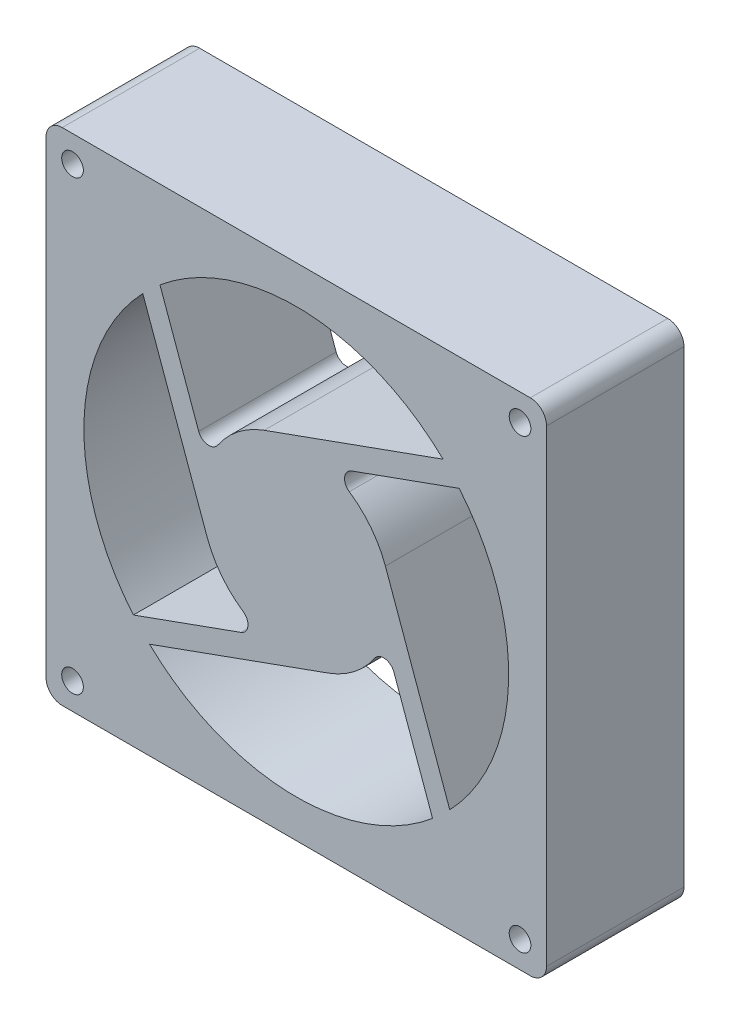
ISO-10303-21;
HEADER;
FILE_DESCRIPTION(('STEP AP214'),'2;1');
FILE_NAME('part.step','',(''),(''),'','','');
FILE_SCHEMA(('AUTOMOTIVE_DESIGN { 1 0 10303 214 1 1 1 1 }'));
ENDSEC;
DATA;
#1=APPLICATION_CONTEXT('core data for automotive mechanical design processes');
#2=APPLICATION_PROTOCOL_DEFINITION('international standard','automotive_design',2000,#1);
#3=PRODUCT_CONTEXT('',#1,'mechanical');
#4=PRODUCT('Part','Part','',(#3));
#5=PRODUCT_RELATED_PRODUCT_CATEGORY('part','',(#4));
#6=PRODUCT_DEFINITION_FORMATION('','',#4);
#7=PRODUCT_DEFINITION_CONTEXT('part definition',#1,'design');
#8=PRODUCT_DEFINITION('design','',#6,#7);
#9=PRODUCT_DEFINITION_SHAPE('','',#8);
#10=(LENGTH_UNIT() NAMED_UNIT(*) SI_UNIT(.MILLI.,.METRE.));
#11=(NAMED_UNIT(*) PLANE_ANGLE_UNIT() SI_UNIT($,.RADIAN.));
#12=(NAMED_UNIT(*) SI_UNIT($,.STERADIAN.) SOLID_ANGLE_UNIT());
#13=UNCERTAINTY_MEASURE_WITH_UNIT(LENGTH_MEASURE(1.E-05),#10,'distance_accuracy_value','');
#14=(GEOMETRIC_REPRESENTATION_CONTEXT(3) GLOBAL_UNCERTAINTY_ASSIGNED_CONTEXT((#13)) GLOBAL_UNIT_ASSIGNED_CONTEXT((#10,
#11,#12)) REPRESENTATION_CONTEXT('',''));
#15=CARTESIAN_POINT('',(0.,0.,0.));
#16=DIRECTION('',(0.,0.,1.));
#17=DIRECTION('',(1.,0.,0.));
#18=AXIS2_PLACEMENT_3D('',#15,#16,#17);
#19=CARTESIAN_POINT('',(0.,0.,25.4));
#20=DIRECTION('',(0.,0.,1.));
#21=DIRECTION('',(1.,0.,0.));
#22=AXIS2_PLACEMENT_3D('',#19,#20,#21);
#23=PLANE('',#22);
#24=CARTESIAN_POINT('',(41.35,-41.35,25.4));
#25=DIRECTION('',(0.,0.,1.));
#26=DIRECTION('',(1.,0.,0.));
#27=AXIS2_PLACEMENT_3D('',#24,#25,#26);
#28=CIRCLE('',#27,2.);
#29=CARTESIAN_POINT('',(43.35,-41.35,25.4));
#30=VERTEX_POINT('',#29);
#31=EDGE_CURVE('E457',#30,#30,#28,.T.);
#32=ORIENTED_EDGE('',*,*,#31,.F.);
#33=EDGE_LOOP('',(#32));
#34=FACE_BOUND('',#33,.T.);
#35=CARTESIAN_POINT('',(-41.35,41.35,25.4));
#36=DIRECTION('',(0.,0.,1.));
#37=DIRECTION('',(1.,0.,0.));
#38=AXIS2_PLACEMENT_3D('',#35,#36,#37);
#39=CIRCLE('',#38,2.);
#40=CARTESIAN_POINT('',(-39.35,41.35,25.4));
#41=VERTEX_POINT('',#40);
#42=EDGE_CURVE('E473',#41,#41,#39,.T.);
#43=ORIENTED_EDGE('',*,*,#42,.F.);
#44=EDGE_LOOP('',(#43));
#45=FACE_BOUND('',#44,.T.);
#46=DIRECTION('',(0.,-1.,0.));
#47=VECTOR('',#46,1.);
#48=CARTESIAN_POINT('',(-46.25,46.25,25.4));
#49=LINE('',#48,#47);
#50=CARTESIAN_POINT('',(-46.25,43.25,25.4));
#51=VERTEX_POINT('',#50);
#52=CARTESIAN_POINT('',(-46.25,-43.25,25.4));
#53=VERTEX_POINT('',#52);
#54=EDGE_CURVE('E481',#51,#53,#49,.T.);
#55=ORIENTED_EDGE('',*,*,#54,.T.);
#56=CARTESIAN_POINT('',(-43.25,-43.25,25.4));
#57=DIRECTION('',(0.,0.,1.));
#58=DIRECTION('',(1.,0.,0.));
#59=AXIS2_PLACEMENT_3D('',#56,#57,#58);
#60=CIRCLE('',#59,3.);
#61=CARTESIAN_POINT('',(-43.25,-46.25,25.4));
#62=VERTEX_POINT('',#61);
#63=EDGE_CURVE('E543',#53,#62,#60,.T.);
#64=ORIENTED_EDGE('',*,*,#63,.T.);
#65=DIRECTION('',(1.,0.,0.));
#66=VECTOR('',#65,1.);
#67=CARTESIAN_POINT('',(-46.25,-46.25,25.4));
#68=LINE('',#67,#66);
#69=CARTESIAN_POINT('',(43.25,-46.25,25.4));
#70=VERTEX_POINT('',#69);
#71=EDGE_CURVE('E485',#62,#70,#68,.T.);
#72=ORIENTED_EDGE('',*,*,#71,.T.);
#73=CARTESIAN_POINT('',(43.25,-43.25,25.4));
#74=DIRECTION('',(0.,0.,1.));
#75=DIRECTION('',(1.,0.,0.));
#76=AXIS2_PLACEMENT_3D('',#73,#74,#75);
#77=CIRCLE('',#76,3.);
#78=CARTESIAN_POINT('',(46.25,-43.25,25.4));
#79=VERTEX_POINT('',#78);
#80=EDGE_CURVE('E540',#70,#79,#77,.T.);
#81=ORIENTED_EDGE('',*,*,#80,.T.);
#82=DIRECTION('',(0.,1.,0.));
#83=VECTOR('',#82,1.);
#84=CARTESIAN_POINT('',(46.25,46.25,25.4));
#85=LINE('',#84,#83);
#86=CARTESIAN_POINT('',(46.25,43.25,25.4));
#87=VERTEX_POINT('',#86);
#88=EDGE_CURVE('E490',#79,#87,#85,.T.);
#89=ORIENTED_EDGE('',*,*,#88,.T.);
#90=CARTESIAN_POINT('',(43.25,43.25,25.4));
#91=DIRECTION('',(0.,0.,1.));
#92=DIRECTION('',(1.,0.,0.));
#93=AXIS2_PLACEMENT_3D('',#90,#91,#92);
#94=CIRCLE('',#93,3.);
#95=CARTESIAN_POINT('',(43.25,46.25,25.4));
#96=VERTEX_POINT('',#95);
#97=EDGE_CURVE('E60',#87,#96,#94,.T.);
#98=ORIENTED_EDGE('',*,*,#97,.T.);
#99=DIRECTION('',(-1.,0.,0.));
#100=VECTOR('',#99,1.);
#101=CARTESIAN_POINT('',(-46.25,46.25,25.4));
#102=LINE('',#101,#100);
#103=CARTESIAN_POINT('',(-43.25,46.25,25.4));
#104=VERTEX_POINT('',#103);
#105=EDGE_CURVE('E493',#96,#104,#102,.T.);
#106=ORIENTED_EDGE('',*,*,#105,.T.);
#107=CARTESIAN_POINT('',(-43.25,43.25,25.4));
#108=DIRECTION('',(0.,0.,1.));
#109=DIRECTION('',(1.,0.,0.));
#110=AXIS2_PLACEMENT_3D('',#107,#108,#109);
#111=CIRCLE('',#110,3.);
#112=EDGE_CURVE('E537',#104,#51,#111,.T.);
#113=ORIENTED_EDGE('',*,*,#112,.T.);
#114=EDGE_LOOP('',(#55,#64,#72,#81,#89,#98,#106,#113));
#115=FACE_BOUND('',#114,.T.);
#116=CARTESIAN_POINT('',(-41.35,-41.35,25.4));
#117=DIRECTION('',(0.,0.,1.));
#118=DIRECTION('',(1.,0.,0.));
#119=AXIS2_PLACEMENT_3D('',#116,#117,#118);
#120=CIRCLE('',#119,2.);
#121=CARTESIAN_POINT('',(-39.35,-41.35,25.4));
#122=VERTEX_POINT('',#121);
#123=EDGE_CURVE('E465',#122,#122,#120,.T.);
#124=ORIENTED_EDGE('',*,*,#123,.F.);
#125=EDGE_LOOP('',(#124));
#126=FACE_BOUND('',#125,.T.);
#127=CARTESIAN_POINT('',(41.35,41.35,25.4));
#128=DIRECTION('',(0.,0.,1.));
#129=DIRECTION('',(1.,0.,0.));
#130=AXIS2_PLACEMENT_3D('',#127,#128,#129);
#131=CIRCLE('',#130,2.);
#132=CARTESIAN_POINT('',(43.35,41.35,25.4));
#133=VERTEX_POINT('',#132);
#134=EDGE_CURVE('E449',#133,#133,#131,.T.);
#135=ORIENTED_EDGE('',*,*,#134,.F.);
#136=EDGE_LOOP('',(#135));
#137=FACE_BOUND('',#136,.T.);
#138=DIRECTION('',(0.338728050885562,-0.940884322083894,0.));
#139=VECTOR('',#138,1.);
#140=CARTESIAN_POINT('',(16.4654756364681,5.92774089049734,25.4));
#141=LINE('',#140,#139);
#142=CARTESIAN_POINT('',(16.4654756364681,5.92774089049734,25.4));
#143=VERTEX_POINT('',#142);
#144=CARTESIAN_POINT('',(28.3659350270967,-27.128144611059,25.4));
#145=VERTEX_POINT('',#144);
#146=EDGE_CURVE('E399',#143,#145,#141,.T.);
#147=ORIENTED_EDGE('',*,*,#146,.F.);
#148=CARTESIAN_POINT('',(0.,0.,25.4));
#149=DIRECTION('',(0.,0.,-1.));
#150=DIRECTION('',(-1.,0.,0.));
#151=AXIS2_PLACEMENT_3D('',#148,#149,#150);
#152=CIRCLE('',#151,17.5);
#153=CARTESIAN_POINT('',(9.80151535287591,14.4975962416994,25.4));
#154=VERTEX_POINT('',#153);
#155=EDGE_CURVE('E396',#154,#143,#152,.T.);
#156=ORIENTED_EDGE('',*,*,#155,.F.);
#157=CARTESIAN_POINT('',(10.9216885360617,16.154464383608,25.4));
#158=DIRECTION('',(0.,0.,1.));
#159=DIRECTION('',(1.,0.,0.));
#160=AXIS2_PLACEMENT_3D('',#157,#158,#159);
#161=CIRCLE('',#160,2.);
#162=CARTESIAN_POINT('',(10.2442324342906,18.0362330277757,25.4));
#163=VERTEX_POINT('',#162);
#164=EDGE_CURVE('E410',#163,#154,#161,.T.);
#165=ORIENTED_EDGE('',*,*,#164,.F.);
#166=DIRECTION('',(-0.940884322083894,-0.338728050885563,0.));
#167=VECTOR('',#166,1.);
#168=CARTESIAN_POINT('',(30.1037371237962,25.1858593496703,25.4));
#169=LINE('',#168,#167);
#170=CARTESIAN_POINT('',(30.1037371237962,25.1858593496703,25.4));
#171=VERTEX_POINT('',#170);
#172=EDGE_CURVE('E406',#171,#163,#169,.T.);
#173=ORIENTED_EDGE('',*,*,#172,.F.);
#174=CARTESIAN_POINT('',(0.,0.,25.4));
#175=DIRECTION('',(0.,0.,1.));
#176=DIRECTION('',(1.,0.,0.));
#177=AXIS2_PLACEMENT_3D('',#174,#175,#176);
#178=CIRCLE('',#177,39.25);
#179=EDGE_CURVE('E403',#145,#171,#178,.T.);
#180=ORIENTED_EDGE('',*,*,#179,.F.);
#181=EDGE_LOOP('',(#147,#156,#165,#173,#180));
#182=FACE_BOUND('',#181,.T.);
#183=DIRECTION('',(-0.940884322083895,-0.338728050885559,0.));
#184=VECTOR('',#183,1.);
#185=CARTESIAN_POINT('',(5.92774089049728,-16.4654756364682,25.4));
#186=LINE('',#185,#184);
#187=CARTESIAN_POINT('',(5.92774089049728,-16.4654756364682,25.4));
#188=VERTEX_POINT('',#187);
#189=CARTESIAN_POINT('',(-27.1281446110591,-28.3659350270966,25.4));
#190=VERTEX_POINT('',#189);
#191=EDGE_CURVE('E346',#188,#190,#186,.T.);
#192=ORIENTED_EDGE('',*,*,#191,.F.);
#193=CARTESIAN_POINT('',(0.,0.,25.4));
#194=DIRECTION('',(0.,0.,-1.));
#195=DIRECTION('',(-1.,0.,0.));
#196=AXIS2_PLACEMENT_3D('',#193,#194,#195);
#197=CIRCLE('',#196,17.5);
#198=CARTESIAN_POINT('',(14.4975962416994,-9.80151535287596,25.4));
#199=VERTEX_POINT('',#198);
#200=EDGE_CURVE('E343',#199,#188,#197,.T.);
#201=ORIENTED_EDGE('',*,*,#200,.F.);
#202=CARTESIAN_POINT('',(16.1544643836079,-10.9216885360618,25.4));
#203=DIRECTION('',(0.,0.,1.));
#204=DIRECTION('',(1.,0.,0.));
#205=AXIS2_PLACEMENT_3D('',#202,#203,#204);
#206=CIRCLE('',#205,2.);
#207=CARTESIAN_POINT('',(18.0362330277757,-10.2442324342907,25.4));
#208=VERTEX_POINT('',#207);
#209=EDGE_CURVE('E357',#208,#199,#206,.T.);
#210=ORIENTED_EDGE('',*,*,#209,.F.);
#211=DIRECTION('',(-0.338728050885559,0.940884322083895,0.));
#212=VECTOR('',#211,1.);
#213=CARTESIAN_POINT('',(25.1858593496702,-30.1037371237963,25.4));
#214=LINE('',#213,#212);
#215=CARTESIAN_POINT('',(25.1858593496702,-30.1037371237963,25.4));
#216=VERTEX_POINT('',#215);
#217=EDGE_CURVE('E353',#216,#208,#214,.T.);
#218=ORIENTED_EDGE('',*,*,#217,.F.);
#219=CARTESIAN_POINT('',(0.,0.,25.4));
#220=DIRECTION('',(0.,0.,1.));
#221=DIRECTION('',(1.,0.,0.));
#222=AXIS2_PLACEMENT_3D('',#219,#220,#221);
#223=CIRCLE('',#222,39.25);
#224=EDGE_CURVE('E350',#190,#216,#223,.T.);
#225=ORIENTED_EDGE('',*,*,#224,.F.);
#226=EDGE_LOOP('',(#192,#201,#210,#218,#225));
#227=FACE_BOUND('',#226,.T.);
#228=DIRECTION('',(-0.338728050885555,0.940884322083896,0.));
#229=VECTOR('',#228,1.);
#230=CARTESIAN_POINT('',(-16.4654756364682,-5.92774089049722,25.4));
#231=LINE('',#230,#229);
#232=CARTESIAN_POINT('',(-16.4654756364682,-5.92774089049722,25.4));
#233=VERTEX_POINT('',#232);
#234=CARTESIAN_POINT('',(-28.3659350270965,27.1281446110592,25.4));
#235=VERTEX_POINT('',#234);
#236=EDGE_CURVE('E293',#233,#235,#231,.T.);
#237=ORIENTED_EDGE('',*,*,#236,.F.);
#238=CARTESIAN_POINT('',(0.,0.,25.4));
#239=DIRECTION('',(0.,0.,-1.));
#240=DIRECTION('',(-1.,0.,0.));
#241=AXIS2_PLACEMENT_3D('',#238,#239,#240);
#242=CIRCLE('',#241,17.5);
#243=CARTESIAN_POINT('',(-9.80151535287601,-14.4975962416994,25.4));
#244=VERTEX_POINT('',#243);
#245=EDGE_CURVE('E290',#244,#233,#242,.T.);
#246=ORIENTED_EDGE('',*,*,#245,.F.);
#247=CARTESIAN_POINT('',(-10.9216885360618,-16.1544643836079,25.4));
#248=DIRECTION('',(0.,0.,1.));
#249=DIRECTION('',(1.,0.,0.));
#250=AXIS2_PLACEMENT_3D('',#247,#248,#249);
#251=CIRCLE('',#250,2.);
#252=CARTESIAN_POINT('',(-10.2442324342907,-18.0362330277757,25.4));
#253=VERTEX_POINT('',#252);
#254=EDGE_CURVE('E304',#253,#244,#251,.T.);
#255=ORIENTED_EDGE('',*,*,#254,.F.);
#256=DIRECTION('',(0.940884322083896,0.338728050885556,0.));
#257=VECTOR('',#256,1.);
#258=CARTESIAN_POINT('',(-30.1037371237964,-25.1858593496701,25.4));
#259=LINE('',#258,#257);
#260=CARTESIAN_POINT('',(-30.1037371237964,-25.1858593496701,25.4));
#261=VERTEX_POINT('',#260);
#262=EDGE_CURVE('E300',#261,#253,#259,.T.);
#263=ORIENTED_EDGE('',*,*,#262,.F.);
#264=CARTESIAN_POINT('',(0.,0.,25.4));
#265=DIRECTION('',(0.,0.,1.));
#266=DIRECTION('',(1.,0.,0.));
#267=AXIS2_PLACEMENT_3D('',#264,#265,#266);
#268=CIRCLE('',#267,39.25);
#269=EDGE_CURVE('E297',#235,#261,#268,.T.);
#270=ORIENTED_EDGE('',*,*,#269,.F.);
#271=EDGE_LOOP('',(#237,#246,#255,#263,#270));
#272=FACE_BOUND('',#271,.T.);
#273=DIRECTION('',(0.940884322083897,0.338728050885552,0.));
#274=VECTOR('',#273,1.);
#275=CARTESIAN_POINT('',(-5.92774089049716,16.4654756364682,25.4));
#276=LINE('',#275,#274);
#277=CARTESIAN_POINT('',(-5.92774089049716,16.4654756364682,25.4));
#278=VERTEX_POINT('',#277);
#279=CARTESIAN_POINT('',(27.1281446110593,28.3659350270964,25.4));
#280=VERTEX_POINT('',#279);
#281=EDGE_CURVE('E237',#278,#280,#276,.T.);
#282=ORIENTED_EDGE('',*,*,#281,.F.);
#283=CARTESIAN_POINT('',(0.,0.,25.4));
#284=DIRECTION('',(0.,0.,-1.));
#285=DIRECTION('',(-1.,0.,0.));
#286=AXIS2_PLACEMENT_3D('',#283,#284,#285);
#287=CIRCLE('',#286,17.5);
#288=CARTESIAN_POINT('',(-14.4975962416993,9.80151535287606,25.4));
#289=VERTEX_POINT('',#288);
#290=EDGE_CURVE('E226',#289,#278,#287,.T.);
#291=ORIENTED_EDGE('',*,*,#290,.F.);
#292=CARTESIAN_POINT('',(-16.1544643836078,10.9216885360619,25.4));
#293=DIRECTION('',(0.,0.,1.));
#294=DIRECTION('',(1.,0.,0.));
#295=AXIS2_PLACEMENT_3D('',#292,#293,#294);
#296=CIRCLE('',#295,2.);
#297=CARTESIAN_POINT('',(-18.0362330277756,10.2442324342908,25.4));
#298=VERTEX_POINT('',#297);
#299=EDGE_CURVE('E261',#298,#289,#296,.T.);
#300=ORIENTED_EDGE('',*,*,#299,.F.);
#301=DIRECTION('',(0.338728050885553,-0.940884322083897,0.));
#302=VECTOR('',#301,1.);
#303=CARTESIAN_POINT('',(-25.18585934967,30.1037371237965,25.4));
#304=LINE('',#303,#302);
#305=CARTESIAN_POINT('',(-25.18585934967,30.1037371237965,25.4));
#306=VERTEX_POINT('',#305);
#307=EDGE_CURVE('E255',#306,#298,#304,.T.);
#308=ORIENTED_EDGE('',*,*,#307,.F.);
#309=CARTESIAN_POINT('',(0.,0.,25.4));
#310=DIRECTION('',(0.,0.,1.));
#311=DIRECTION('',(1.,0.,0.));
#312=AXIS2_PLACEMENT_3D('',#309,#310,#311);
#313=CIRCLE('',#312,39.25);
#314=EDGE_CURVE('E251',#280,#306,#313,.T.);
#315=ORIENTED_EDGE('',*,*,#314,.F.);
#316=EDGE_LOOP('',(#282,#291,#300,#308,#315));
#317=FACE_BOUND('',#316,.T.);
#318=ADVANCED_FACE('F39',(#34,#45,#115,#126,#137,#182,#227,#272,#317),#23,.T.);
#319=CARTESIAN_POINT('',(0.,0.,0.));
#320=DIRECTION('',(0.,0.,1.));
#321=DIRECTION('',(1.,0.,0.));
#322=AXIS2_PLACEMENT_3D('',#319,#320,#321);
#323=PLANE('',#322);
#324=CARTESIAN_POINT('',(0.,0.,0.));
#325=DIRECTION('',(0.,0.,-1.));
#326=DIRECTION('',(-1.,0.,0.));
#327=AXIS2_PLACEMENT_3D('',#324,#325,#326);
#328=CIRCLE('',#327,17.5);
#329=CARTESIAN_POINT('',(-9.80151535287601,-14.4975962416994,0.));
#330=VERTEX_POINT('',#329);
#331=CARTESIAN_POINT('',(-16.4654756364682,-5.92774089049722,0.));
#332=VERTEX_POINT('',#331);
#333=EDGE_CURVE('E246',#330,#332,#328,.T.);
#334=ORIENTED_EDGE('',*,*,#333,.T.);
#335=DIRECTION('',(-0.338728050885555,0.940884322083896,0.));
#336=VECTOR('',#335,1.);
#337=CARTESIAN_POINT('',(-16.4654756364682,-5.92774089049722,0.));
#338=LINE('',#337,#336);
#339=CARTESIAN_POINT('',(-28.3659350270965,27.1281446110592,0.));
#340=VERTEX_POINT('',#339);
#341=EDGE_CURVE('E311',#332,#340,#338,.T.);
#342=ORIENTED_EDGE('',*,*,#341,.T.);
#343=CARTESIAN_POINT('',(0.,0.,0.));
#344=DIRECTION('',(0.,0.,1.));
#345=DIRECTION('',(1.,0.,0.));
#346=AXIS2_PLACEMENT_3D('',#343,#344,#345);
#347=CIRCLE('',#346,39.25);
#348=CARTESIAN_POINT('',(-30.1037371237964,-25.1858593496701,0.));
#349=VERTEX_POINT('',#348);
#350=EDGE_CURVE('E315',#340,#349,#347,.T.);
#351=ORIENTED_EDGE('',*,*,#350,.T.);
#352=DIRECTION('',(0.940884322083896,0.338728050885556,0.));
#353=VECTOR('',#352,1.);
#354=CARTESIAN_POINT('',(-30.1037371237964,-25.1858593496701,0.));
#355=LINE('',#354,#353);
#356=CARTESIAN_POINT('',(-10.2442324342907,-18.0362330277757,0.));
#357=VERTEX_POINT('',#356);
#358=EDGE_CURVE('E319',#349,#357,#355,.T.);
#359=ORIENTED_EDGE('',*,*,#358,.T.);
#360=CARTESIAN_POINT('',(-10.9216885360618,-16.1544643836079,0.));
#361=DIRECTION('',(0.,0.,1.));
#362=DIRECTION('',(1.,0.,0.));
#363=AXIS2_PLACEMENT_3D('',#360,#361,#362);
#364=CIRCLE('',#363,2.);
#365=EDGE_CURVE('E294',#357,#330,#364,.T.);
#366=ORIENTED_EDGE('',*,*,#365,.T.);
#367=EDGE_LOOP('',(#334,#342,#351,#359,#366));
#368=FACE_BOUND('',#367,.T.);
#369=CARTESIAN_POINT('',(0.,0.,0.));
#370=DIRECTION('',(0.,0.,-1.));
#371=DIRECTION('',(-1.,0.,0.));
#372=AXIS2_PLACEMENT_3D('',#369,#370,#371);
#373=CIRCLE('',#372,17.5);
#374=CARTESIAN_POINT('',(9.80151535287591,14.4975962416994,0.));
#375=VERTEX_POINT('',#374);
#376=CARTESIAN_POINT('',(16.4654756364681,5.92774089049734,0.));
#377=VERTEX_POINT('',#376);
#378=EDGE_CURVE('E395',#375,#377,#373,.T.);
#379=ORIENTED_EDGE('',*,*,#378,.T.);
#380=DIRECTION('',(0.338728050885562,-0.940884322083894,0.));
#381=VECTOR('',#380,1.);
#382=CARTESIAN_POINT('',(16.4654756364681,5.92774089049734,0.));
#383=LINE('',#382,#381);
#384=CARTESIAN_POINT('',(28.3659350270967,-27.128144611059,0.));
#385=VERTEX_POINT('',#384);
#386=EDGE_CURVE('E417',#377,#385,#383,.T.);
#387=ORIENTED_EDGE('',*,*,#386,.T.);
#388=CARTESIAN_POINT('',(0.,0.,0.));
#389=DIRECTION('',(0.,0.,1.));
#390=DIRECTION('',(1.,0.,0.));
#391=AXIS2_PLACEMENT_3D('',#388,#389,#390);
#392=CIRCLE('',#391,39.25);
#393=CARTESIAN_POINT('',(30.1037371237962,25.1858593496703,0.));
#394=VERTEX_POINT('',#393);
#395=EDGE_CURVE('E421',#385,#394,#392,.T.);
#396=ORIENTED_EDGE('',*,*,#395,.T.);
#397=DIRECTION('',(-0.940884322083894,-0.338728050885563,0.));
#398=VECTOR('',#397,1.);
#399=CARTESIAN_POINT('',(30.1037371237962,25.1858593496703,0.));
#400=LINE('',#399,#398);
#401=CARTESIAN_POINT('',(10.2442324342906,18.0362330277757,0.));
#402=VERTEX_POINT('',#401);
#403=EDGE_CURVE('E425',#394,#402,#400,.T.);
#404=ORIENTED_EDGE('',*,*,#403,.T.);
#405=CARTESIAN_POINT('',(10.9216885360617,16.154464383608,0.));
#406=DIRECTION('',(0.,0.,1.));
#407=DIRECTION('',(1.,0.,0.));
#408=AXIS2_PLACEMENT_3D('',#405,#406,#407);
#409=CIRCLE('',#408,2.);
#410=EDGE_CURVE('E400',#402,#375,#409,.T.);
#411=ORIENTED_EDGE('',*,*,#410,.T.);
#412=EDGE_LOOP('',(#379,#387,#396,#404,#411));
#413=FACE_BOUND('',#412,.T.);
#414=DIRECTION('',(1.,0.,0.));
#415=VECTOR('',#414,1.);
#416=CARTESIAN_POINT('',(-46.25,-46.25,0.));
#417=LINE('',#416,#415);
#418=CARTESIAN_POINT('',(-43.25,-46.25,0.));
#419=VERTEX_POINT('',#418);
#420=CARTESIAN_POINT('',(43.25,-46.25,0.));
#421=VERTEX_POINT('',#420);
#422=EDGE_CURVE('E500',#419,#421,#417,.T.);
#423=ORIENTED_EDGE('',*,*,#422,.F.);
#424=CARTESIAN_POINT('',(-43.25,-43.25,0.));
#425=DIRECTION('',(0.,0.,1.));
#426=DIRECTION('',(1.,0.,0.));
#427=AXIS2_PLACEMENT_3D('',#424,#425,#426);
#428=CIRCLE('',#427,3.);
#429=CARTESIAN_POINT('',(-46.25,-43.25,0.));
#430=VERTEX_POINT('',#429);
#431=EDGE_CURVE('E525',#419,#430,#428,.F.);
#432=ORIENTED_EDGE('',*,*,#431,.T.);
#433=DIRECTION('',(0.,-1.,0.));
#434=VECTOR('',#433,1.);
#435=CARTESIAN_POINT('',(-46.25,46.25,0.));
#436=LINE('',#435,#434);
#437=CARTESIAN_POINT('',(-46.25,43.25,0.));
#438=VERTEX_POINT('',#437);
#439=EDGE_CURVE('E477',#438,#430,#436,.T.);
#440=ORIENTED_EDGE('',*,*,#439,.F.);
#441=CARTESIAN_POINT('',(-43.25,43.25,0.));
#442=DIRECTION('',(0.,0.,1.));
#443=DIRECTION('',(1.,0.,0.));
#444=AXIS2_PLACEMENT_3D('',#441,#442,#443);
#445=CIRCLE('',#444,3.);
#446=CARTESIAN_POINT('',(-43.25,46.25,0.));
#447=VERTEX_POINT('',#446);
#448=EDGE_CURVE('E519',#438,#447,#445,.F.);
#449=ORIENTED_EDGE('',*,*,#448,.T.);
#450=DIRECTION('',(-1.,0.,0.));
#451=VECTOR('',#450,1.);
#452=CARTESIAN_POINT('',(-46.25,46.25,0.));
#453=LINE('',#452,#451);
#454=CARTESIAN_POINT('',(43.25,46.25,0.));
#455=VERTEX_POINT('',#454);
#456=EDGE_CURVE('E486',#455,#447,#453,.T.);
#457=ORIENTED_EDGE('',*,*,#456,.F.);
#458=CARTESIAN_POINT('',(43.25,43.25,0.));
#459=DIRECTION('',(0.,0.,1.));
#460=DIRECTION('',(1.,0.,0.));
#461=AXIS2_PLACEMENT_3D('',#458,#459,#460);
#462=CIRCLE('',#461,3.);
#463=CARTESIAN_POINT('',(46.25,43.25,0.));
#464=VERTEX_POINT('',#463);
#465=EDGE_CURVE('E516',#455,#464,#462,.F.);
#466=ORIENTED_EDGE('',*,*,#465,.T.);
#467=DIRECTION('',(0.,1.,0.));
#468=VECTOR('',#467,1.);
#469=CARTESIAN_POINT('',(46.25,46.25,0.));
#470=LINE('',#469,#468);
#471=CARTESIAN_POINT('',(46.25,-43.25,0.));
#472=VERTEX_POINT('',#471);
#473=EDGE_CURVE('E504',#472,#464,#470,.T.);
#474=ORIENTED_EDGE('',*,*,#473,.F.);
#475=CARTESIAN_POINT('',(43.25,-43.25,0.));
#476=DIRECTION('',(0.,0.,1.));
#477=DIRECTION('',(1.,0.,0.));
#478=AXIS2_PLACEMENT_3D('',#475,#476,#477);
#479=CIRCLE('',#478,3.);
#480=EDGE_CURVE('E522',#472,#421,#479,.F.);
#481=ORIENTED_EDGE('',*,*,#480,.T.);
#482=EDGE_LOOP('',(#423,#432,#440,#449,#457,#466,#474,#481));
#483=FACE_BOUND('',#482,.T.);
#484=CARTESIAN_POINT('',(-41.35,41.35,0.));
#485=DIRECTION('',(0.,0.,1.));
#486=DIRECTION('',(1.,0.,0.));
#487=AXIS2_PLACEMENT_3D('',#484,#485,#486);
#488=CIRCLE('',#487,2.);
#489=CARTESIAN_POINT('',(-39.35,41.35,0.));
#490=VERTEX_POINT('',#489);
#491=EDGE_CURVE('E469',#490,#490,#488,.T.);
#492=ORIENTED_EDGE('',*,*,#491,.T.);
#493=EDGE_LOOP('',(#492));
#494=FACE_BOUND('',#493,.T.);
#495=CARTESIAN_POINT('',(-41.35,-41.35,0.));
#496=DIRECTION('',(0.,0.,1.));
#497=DIRECTION('',(1.,0.,0.));
#498=AXIS2_PLACEMENT_3D('',#495,#496,#497);
#499=CIRCLE('',#498,2.);
#500=CARTESIAN_POINT('',(-39.35,-41.35,0.));
#501=VERTEX_POINT('',#500);
#502=EDGE_CURVE('E461',#501,#501,#499,.T.);
#503=ORIENTED_EDGE('',*,*,#502,.T.);
#504=EDGE_LOOP('',(#503));
#505=FACE_BOUND('',#504,.T.);
#506=CARTESIAN_POINT('',(41.35,-41.35,0.));
#507=DIRECTION('',(0.,0.,1.));
#508=DIRECTION('',(1.,0.,0.));
#509=AXIS2_PLACEMENT_3D('',#506,#507,#508);
#510=CIRCLE('',#509,2.);
#511=CARTESIAN_POINT('',(43.35,-41.35,0.));
#512=VERTEX_POINT('',#511);
#513=EDGE_CURVE('E453',#512,#512,#510,.T.);
#514=ORIENTED_EDGE('',*,*,#513,.T.);
#515=EDGE_LOOP('',(#514));
#516=FACE_BOUND('',#515,.T.);
#517=CARTESIAN_POINT('',(41.35,41.35,0.));
#518=DIRECTION('',(0.,0.,1.));
#519=DIRECTION('',(1.,0.,0.));
#520=AXIS2_PLACEMENT_3D('',#517,#518,#519);
#521=CIRCLE('',#520,2.);
#522=CARTESIAN_POINT('',(43.35,41.35,0.));
#523=VERTEX_POINT('',#522);
#524=EDGE_CURVE('E448',#523,#523,#521,.T.);
#525=ORIENTED_EDGE('',*,*,#524,.T.);
#526=EDGE_LOOP('',(#525));
#527=FACE_BOUND('',#526,.T.);
#528=CARTESIAN_POINT('',(0.,0.,0.));
#529=DIRECTION('',(0.,0.,-1.));
#530=DIRECTION('',(-1.,0.,0.));
#531=AXIS2_PLACEMENT_3D('',#528,#529,#530);
#532=CIRCLE('',#531,17.5);
#533=CARTESIAN_POINT('',(14.4975962416994,-9.80151535287596,0.));
#534=VERTEX_POINT('',#533);
#535=CARTESIAN_POINT('',(5.92774089049728,-16.4654756364682,0.));
#536=VERTEX_POINT('',#535);
#537=EDGE_CURVE('E342',#534,#536,#532,.T.);
#538=ORIENTED_EDGE('',*,*,#537,.T.);
#539=DIRECTION('',(-0.940884322083895,-0.338728050885559,0.));
#540=VECTOR('',#539,1.);
#541=CARTESIAN_POINT('',(5.92774089049728,-16.4654756364682,0.));
#542=LINE('',#541,#540);
#543=CARTESIAN_POINT('',(-27.1281446110591,-28.3659350270966,0.));
#544=VERTEX_POINT('',#543);
#545=EDGE_CURVE('E364',#536,#544,#542,.T.);
#546=ORIENTED_EDGE('',*,*,#545,.T.);
#547=CARTESIAN_POINT('',(0.,0.,0.));
#548=DIRECTION('',(0.,0.,1.));
#549=DIRECTION('',(1.,0.,0.));
#550=AXIS2_PLACEMENT_3D('',#547,#548,#549);
#551=CIRCLE('',#550,39.25);
#552=CARTESIAN_POINT('',(25.1858593496702,-30.1037371237963,0.));
#553=VERTEX_POINT('',#552);
#554=EDGE_CURVE('E368',#544,#553,#551,.T.);
#555=ORIENTED_EDGE('',*,*,#554,.T.);
#556=DIRECTION('',(-0.338728050885559,0.940884322083895,0.));
#557=VECTOR('',#556,1.);
#558=CARTESIAN_POINT('',(25.1858593496702,-30.1037371237963,0.));
#559=LINE('',#558,#557);
#560=CARTESIAN_POINT('',(18.0362330277757,-10.2442324342907,0.));
#561=VERTEX_POINT('',#560);
#562=EDGE_CURVE('E372',#553,#561,#559,.T.);
#563=ORIENTED_EDGE('',*,*,#562,.T.);
#564=CARTESIAN_POINT('',(16.1544643836079,-10.9216885360618,0.));
#565=DIRECTION('',(0.,0.,1.));
#566=DIRECTION('',(1.,0.,0.));
#567=AXIS2_PLACEMENT_3D('',#564,#565,#566);
#568=CIRCLE('',#567,2.);
#569=EDGE_CURVE('E347',#561,#534,#568,.T.);
#570=ORIENTED_EDGE('',*,*,#569,.T.);
#571=EDGE_LOOP('',(#538,#546,#555,#563,#570));
#572=FACE_BOUND('',#571,.T.);
#573=CARTESIAN_POINT('',(0.,0.,0.));
#574=DIRECTION('',(0.,0.,-1.));
#575=DIRECTION('',(-1.,0.,0.));
#576=AXIS2_PLACEMENT_3D('',#573,#574,#575);
#577=CIRCLE('',#576,17.5);
#578=CARTESIAN_POINT('',(-14.4975962416993,9.80151535287606,0.));
#579=VERTEX_POINT('',#578);
#580=CARTESIAN_POINT('',(-5.92774089049716,16.4654756364682,0.));
#581=VERTEX_POINT('',#580);
#582=EDGE_CURVE('E264',#579,#581,#577,.T.);
#583=ORIENTED_EDGE('',*,*,#582,.T.);
#584=DIRECTION('',(0.940884322083897,0.338728050885552,0.));
#585=VECTOR('',#584,1.);
#586=CARTESIAN_POINT('',(-5.92774089049716,16.4654756364682,0.));
#587=LINE('',#586,#585);
#588=CARTESIAN_POINT('',(27.1281446110593,28.3659350270964,0.));
#589=VERTEX_POINT('',#588);
#590=EDGE_CURVE('E244',#581,#589,#587,.T.);
#591=ORIENTED_EDGE('',*,*,#590,.T.);
#592=CARTESIAN_POINT('',(0.,0.,0.));
#593=DIRECTION('',(0.,0.,1.));
#594=DIRECTION('',(1.,0.,0.));
#595=AXIS2_PLACEMENT_3D('',#592,#593,#594);
#596=CIRCLE('',#595,39.25);
#597=CARTESIAN_POINT('',(-25.18585934967,30.1037371237965,0.));
#598=VERTEX_POINT('',#597);
#599=EDGE_CURVE('E269',#589,#598,#596,.T.);
#600=ORIENTED_EDGE('',*,*,#599,.T.);
#601=DIRECTION('',(0.338728050885553,-0.940884322083897,0.));
#602=VECTOR('',#601,1.);
#603=CARTESIAN_POINT('',(-25.18585934967,30.1037371237965,0.));
#604=LINE('',#603,#602);
#605=CARTESIAN_POINT('',(-18.0362330277756,10.2442324342908,0.));
#606=VERTEX_POINT('',#605);
#607=EDGE_CURVE('E273',#598,#606,#604,.T.);
#608=ORIENTED_EDGE('',*,*,#607,.T.);
#609=CARTESIAN_POINT('',(-16.1544643836078,10.9216885360619,0.));
#610=DIRECTION('',(0.,0.,1.));
#611=DIRECTION('',(1.,0.,0.));
#612=AXIS2_PLACEMENT_3D('',#609,#610,#611);
#613=CIRCLE('',#612,2.);
#614=EDGE_CURVE('E238',#606,#579,#613,.T.);
#615=ORIENTED_EDGE('',*,*,#614,.T.);
#616=EDGE_LOOP('',(#583,#591,#600,#608,#615));
#617=FACE_BOUND('',#616,.T.);
#618=ADVANCED_FACE('F560',(#368,#413,#483,#494,#505,#516,#527,#572,#617),#323,.F.);
#619=CARTESIAN_POINT('',(-46.25,46.25,25.4));
#620=DIRECTION('',(1.,0.,0.));
#621=DIRECTION('',(0.,1.,0.));
#622=AXIS2_PLACEMENT_3D('',#619,#620,#621);
#623=PLANE('',#622);
#624=ORIENTED_EDGE('',*,*,#439,.T.);
#625=DIRECTION('',(0.,0.,-1.));
#626=VECTOR('',#625,1.);
#627=CARTESIAN_POINT('',(-46.25,-43.25,25.4));
#628=LINE('',#627,#626);
#629=EDGE_CURVE('E532',#430,#53,#628,.F.);
#630=ORIENTED_EDGE('',*,*,#629,.T.);
#631=ORIENTED_EDGE('',*,*,#54,.F.);
#632=DIRECTION('',(0.,0.,-1.));
#633=VECTOR('',#632,1.);
#634=CARTESIAN_POINT('',(-46.25,43.25,25.4));
#635=LINE('',#634,#633);
#636=EDGE_CURVE('E528',#51,#438,#635,.T.);
#637=ORIENTED_EDGE('',*,*,#636,.T.);
#638=EDGE_LOOP('',(#624,#630,#631,#637));
#639=FACE_BOUND('',#638,.T.);
#640=ADVANCED_FACE('F570',(#639),#623,.F.);
#641=CARTESIAN_POINT('',(-46.25,-46.25,25.4));
#642=DIRECTION('',(0.,1.,0.));
#643=DIRECTION('',(0.,0.,1.));
#644=AXIS2_PLACEMENT_3D('',#641,#642,#643);
#645=PLANE('',#644);
#646=ORIENTED_EDGE('',*,*,#71,.F.);
#647=DIRECTION('',(0.,0.,-1.));
#648=VECTOR('',#647,1.);
#649=CARTESIAN_POINT('',(-43.25,-46.25,25.4));
#650=LINE('',#649,#648);
#651=EDGE_CURVE('E512',#62,#419,#650,.T.);
#652=ORIENTED_EDGE('',*,*,#651,.T.);
#653=ORIENTED_EDGE('',*,*,#422,.T.);
#654=DIRECTION('',(0.,0.,-1.));
#655=VECTOR('',#654,1.);
#656=CARTESIAN_POINT('',(43.25,-46.25,25.4));
#657=LINE('',#656,#655);
#658=EDGE_CURVE('E496',#421,#70,#657,.F.);
#659=ORIENTED_EDGE('',*,*,#658,.T.);
#660=EDGE_LOOP('',(#646,#652,#653,#659));
#661=FACE_BOUND('',#660,.T.);
#662=ADVANCED_FACE('F579',(#661),#645,.F.);
#663=CARTESIAN_POINT('',(46.25,46.25,25.4));
#664=DIRECTION('',(-1.,0.,0.));
#665=DIRECTION('',(0.,0.,1.));
#666=AXIS2_PLACEMENT_3D('',#663,#664,#665);
#667=PLANE('',#666);
#668=ORIENTED_EDGE('',*,*,#88,.F.);
#669=DIRECTION('',(0.,0.,-1.));
#670=VECTOR('',#669,1.);
#671=CARTESIAN_POINT('',(46.25,-43.25,25.4));
#672=LINE('',#671,#670);
#673=EDGE_CURVE('E549',#79,#472,#672,.T.);
#674=ORIENTED_EDGE('',*,*,#673,.T.);
#675=ORIENTED_EDGE('',*,*,#473,.T.);
#676=DIRECTION('',(0.,0.,-1.));
#677=VECTOR('',#676,1.);
#678=CARTESIAN_POINT('',(46.25,43.25,25.4));
#679=LINE('',#678,#677);
#680=EDGE_CURVE('E546',#464,#87,#679,.F.);
#681=ORIENTED_EDGE('',*,*,#680,.T.);
#682=EDGE_LOOP('',(#668,#674,#675,#681));
#683=FACE_BOUND('',#682,.T.);
#684=ADVANCED_FACE('F587',(#683),#667,.F.);
#685=CARTESIAN_POINT('',(-46.25,46.25,25.4));
#686=DIRECTION('',(0.,-1.,0.));
#687=DIRECTION('',(0.,0.,-1.));
#688=AXIS2_PLACEMENT_3D('',#685,#686,#687);
#689=PLANE('',#688);
#690=ORIENTED_EDGE('',*,*,#456,.T.);
#691=DIRECTION('',(0.,0.,-1.));
#692=VECTOR('',#691,1.);
#693=CARTESIAN_POINT('',(-43.25,46.25,25.4));
#694=LINE('',#693,#692);
#695=EDGE_CURVE('E11',#447,#104,#694,.F.);
#696=ORIENTED_EDGE('',*,*,#695,.T.);
#697=ORIENTED_EDGE('',*,*,#105,.F.);
#698=DIRECTION('',(0.,0.,-1.));
#699=VECTOR('',#698,1.);
#700=CARTESIAN_POINT('',(43.25,46.25,25.4));
#701=LINE('',#700,#699);
#702=EDGE_CURVE('E48',#96,#455,#701,.T.);
#703=ORIENTED_EDGE('',*,*,#702,.T.);
#704=EDGE_LOOP('',(#690,#696,#697,#703));
#705=FACE_BOUND('',#704,.T.);
#706=ADVANCED_FACE('F556',(#705),#689,.F.);
#707=CARTESIAN_POINT('',(-41.35,41.35,25.4));
#708=DIRECTION('',(0.,0.,-1.));
#709=DIRECTION('',(-1.,0.,0.));
#710=AXIS2_PLACEMENT_3D('',#707,#708,#709);
#711=CYLINDRICAL_SURFACE('',#710,2.);
#712=ORIENTED_EDGE('',*,*,#42,.T.);
#713=EDGE_LOOP('',(#712));
#714=FACE_BOUND('',#713,.T.);
#715=ORIENTED_EDGE('',*,*,#491,.F.);
#716=EDGE_LOOP('',(#715));
#717=FACE_BOUND('',#716,.T.);
#718=ADVANCED_FACE('F604',(#714,#717),#711,.F.);
#719=CARTESIAN_POINT('',(-41.35,-41.35,25.4));
#720=DIRECTION('',(0.,0.,-1.));
#721=DIRECTION('',(-1.,0.,0.));
#722=AXIS2_PLACEMENT_3D('',#719,#720,#721);
#723=CYLINDRICAL_SURFACE('',#722,2.);
#724=ORIENTED_EDGE('',*,*,#123,.T.);
#725=EDGE_LOOP('',(#724));
#726=FACE_BOUND('',#725,.T.);
#727=ORIENTED_EDGE('',*,*,#502,.F.);
#728=EDGE_LOOP('',(#727));
#729=FACE_BOUND('',#728,.T.);
#730=ADVANCED_FACE('F833',(#726,#729),#723,.F.);
#731=CARTESIAN_POINT('',(41.35,-41.35,25.4));
#732=DIRECTION('',(0.,0.,-1.));
#733=DIRECTION('',(-1.,0.,0.));
#734=AXIS2_PLACEMENT_3D('',#731,#732,#733);
#735=CYLINDRICAL_SURFACE('',#734,2.);
#736=ORIENTED_EDGE('',*,*,#31,.T.);
#737=EDGE_LOOP('',(#736));
#738=FACE_BOUND('',#737,.T.);
#739=ORIENTED_EDGE('',*,*,#513,.F.);
#740=EDGE_LOOP('',(#739));
#741=FACE_BOUND('',#740,.T.);
#742=ADVANCED_FACE('F824',(#738,#741),#735,.F.);
#743=CARTESIAN_POINT('',(41.35,41.35,25.4));
#744=DIRECTION('',(0.,0.,-1.));
#745=DIRECTION('',(-1.,0.,0.));
#746=AXIS2_PLACEMENT_3D('',#743,#744,#745);
#747=CYLINDRICAL_SURFACE('',#746,2.);
#748=ORIENTED_EDGE('',*,*,#134,.T.);
#749=EDGE_LOOP('',(#748));
#750=FACE_BOUND('',#749,.T.);
#751=ORIENTED_EDGE('',*,*,#524,.F.);
#752=EDGE_LOOP('',(#751));
#753=FACE_BOUND('',#752,.T.);
#754=ADVANCED_FACE('F815',(#750,#753),#747,.F.);
#755=CARTESIAN_POINT('',(0.,0.,25.4));
#756=DIRECTION('',(0.,0.,-1.));
#757=DIRECTION('',(-1.,0.,0.));
#758=AXIS2_PLACEMENT_3D('',#755,#756,#757);
#759=CYLINDRICAL_SURFACE('',#758,17.5);
#760=ORIENTED_EDGE('',*,*,#378,.F.);
#761=DIRECTION('',(0.,0.,-1.));
#762=VECTOR('',#761,1.);
#763=CARTESIAN_POINT('',(9.80151535287591,14.4975962416994,25.4));
#764=LINE('',#763,#762);
#765=EDGE_CURVE('E413',#154,#375,#764,.T.);
#766=ORIENTED_EDGE('',*,*,#765,.F.);
#767=ORIENTED_EDGE('',*,*,#155,.T.);
#768=DIRECTION('',(0.,0.,-1.));
#769=VECTOR('',#768,1.);
#770=CARTESIAN_POINT('',(16.4654756364681,5.92774089049734,25.4));
#771=LINE('',#770,#769);
#772=EDGE_CURVE('E444',#143,#377,#771,.T.);
#773=ORIENTED_EDGE('',*,*,#772,.T.);
#774=EDGE_LOOP('',(#760,#766,#767,#773));
#775=FACE_BOUND('',#774,.T.);
#776=ADVANCED_FACE('F806',(#775),#759,.T.);
#777=CARTESIAN_POINT('',(16.4654756364681,5.92774089049734,25.4));
#778=DIRECTION('',(0.940884322083894,0.338728050885562,0.));
#779=DIRECTION('',(-0.338728050885562,0.940884322083894,0.));
#780=AXIS2_PLACEMENT_3D('',#777,#778,#779);
#781=PLANE('',#780);
#782=ORIENTED_EDGE('',*,*,#386,.F.);
#783=ORIENTED_EDGE('',*,*,#772,.F.);
#784=ORIENTED_EDGE('',*,*,#146,.T.);
#785=DIRECTION('',(0.,0.,-1.));
#786=VECTOR('',#785,1.);
#787=CARTESIAN_POINT('',(28.3659350270967,-27.128144611059,25.4));
#788=LINE('',#787,#786);
#789=EDGE_CURVE('E441',#145,#385,#788,.T.);
#790=ORIENTED_EDGE('',*,*,#789,.T.);
#791=EDGE_LOOP('',(#782,#783,#784,#790));
#792=FACE_BOUND('',#791,.T.);
#793=ADVANCED_FACE('F797',(#792),#781,.T.);
#794=CARTESIAN_POINT('',(0.,0.,25.4));
#795=DIRECTION('',(0.,0.,-1.));
#796=DIRECTION('',(-1.,0.,0.));
#797=AXIS2_PLACEMENT_3D('',#794,#795,#796);
#798=CYLINDRICAL_SURFACE('',#797,39.25);
#799=ORIENTED_EDGE('',*,*,#395,.F.);
#800=ORIENTED_EDGE('',*,*,#789,.F.);
#801=ORIENTED_EDGE('',*,*,#179,.T.);
#802=DIRECTION('',(0.,0.,-1.));
#803=VECTOR('',#802,1.);
#804=CARTESIAN_POINT('',(30.1037371237962,25.1858593496703,25.4));
#805=LINE('',#804,#803);
#806=EDGE_CURVE('E438',#171,#394,#805,.T.);
#807=ORIENTED_EDGE('',*,*,#806,.T.);
#808=EDGE_LOOP('',(#799,#800,#801,#807));
#809=FACE_BOUND('',#808,.T.);
#810=ADVANCED_FACE('F788',(#809),#798,.F.);
#811=CARTESIAN_POINT('',(30.1037371237962,25.1858593496703,25.4));
#812=DIRECTION('',(0.338728050885562,-0.940884322083893,0.));
#813=DIRECTION('',(0.940884322083894,0.338728050885562,0.));
#814=AXIS2_PLACEMENT_3D('',#811,#812,#813);
#815=PLANE('',#814);
#816=ORIENTED_EDGE('',*,*,#403,.F.);
#817=ORIENTED_EDGE('',*,*,#806,.F.);
#818=ORIENTED_EDGE('',*,*,#172,.T.);
#819=DIRECTION('',(0.,0.,-1.));
#820=VECTOR('',#819,1.);
#821=CARTESIAN_POINT('',(10.2442324342906,18.0362330277757,25.4));
#822=LINE('',#821,#820);
#823=EDGE_CURVE('E435',#163,#402,#822,.T.);
#824=ORIENTED_EDGE('',*,*,#823,.T.);
#825=EDGE_LOOP('',(#816,#817,#818,#824));
#826=FACE_BOUND('',#825,.T.);
#827=ADVANCED_FACE('F779',(#826),#815,.T.);
#828=CARTESIAN_POINT('',(10.9216885360617,16.154464383608,25.4));
#829=DIRECTION('',(0.,0.,-1.));
#830=DIRECTION('',(-1.,0.,0.));
#831=AXIS2_PLACEMENT_3D('',#828,#829,#830);
#832=CYLINDRICAL_SURFACE('',#831,2.);
#833=ORIENTED_EDGE('',*,*,#410,.F.);
#834=ORIENTED_EDGE('',*,*,#823,.F.);
#835=ORIENTED_EDGE('',*,*,#164,.T.);
#836=ORIENTED_EDGE('',*,*,#765,.T.);
#837=EDGE_LOOP('',(#833,#834,#835,#836));
#838=FACE_BOUND('',#837,.T.);
#839=ADVANCED_FACE('F770',(#838),#832,.F.);
#840=CARTESIAN_POINT('',(0.,0.,25.4));
#841=DIRECTION('',(0.,0.,-1.));
#842=DIRECTION('',(-1.,0.,0.));
#843=AXIS2_PLACEMENT_3D('',#840,#841,#842);
#844=CYLINDRICAL_SURFACE('',#843,17.5);
#845=ORIENTED_EDGE('',*,*,#537,.F.);
#846=DIRECTION('',(0.,0.,-1.));
#847=VECTOR('',#846,1.);
#848=CARTESIAN_POINT('',(14.4975962416994,-9.80151535287596,25.4));
#849=LINE('',#848,#847);
#850=EDGE_CURVE('E360',#199,#534,#849,.T.);
#851=ORIENTED_EDGE('',*,*,#850,.F.);
#852=ORIENTED_EDGE('',*,*,#200,.T.);
#853=DIRECTION('',(0.,0.,-1.));
#854=VECTOR('',#853,1.);
#855=CARTESIAN_POINT('',(5.92774089049728,-16.4654756364682,25.4));
#856=LINE('',#855,#854);
#857=EDGE_CURVE('E391',#188,#536,#856,.T.);
#858=ORIENTED_EDGE('',*,*,#857,.T.);
#859=EDGE_LOOP('',(#845,#851,#852,#858));
#860=FACE_BOUND('',#859,.T.);
#861=ADVANCED_FACE('F761',(#860),#844,.T.);
#862=CARTESIAN_POINT('',(5.92774089049728,-16.4654756364682,25.4));
#863=DIRECTION('',(0.338728050885559,-0.940884322083895,0.));
#864=DIRECTION('',(0.940884322083895,0.338728050885559,0.));
#865=AXIS2_PLACEMENT_3D('',#862,#863,#864);
#866=PLANE('',#865);
#867=ORIENTED_EDGE('',*,*,#545,.F.);
#868=ORIENTED_EDGE('',*,*,#857,.F.);
#869=ORIENTED_EDGE('',*,*,#191,.T.);
#870=DIRECTION('',(0.,0.,-1.));
#871=VECTOR('',#870,1.);
#872=CARTESIAN_POINT('',(-27.1281446110591,-28.3659350270966,25.4));
#873=LINE('',#872,#871);
#874=EDGE_CURVE('E388',#190,#544,#873,.T.);
#875=ORIENTED_EDGE('',*,*,#874,.T.);
#876=EDGE_LOOP('',(#867,#868,#869,#875));
#877=FACE_BOUND('',#876,.T.);
#878=ADVANCED_FACE('F752',(#877),#866,.T.);
#879=CARTESIAN_POINT('',(0.,0.,25.4));
#880=DIRECTION('',(0.,0.,-1.));
#881=DIRECTION('',(-1.,0.,0.));
#882=AXIS2_PLACEMENT_3D('',#879,#880,#881);
#883=CYLINDRICAL_SURFACE('',#882,39.25);
#884=ORIENTED_EDGE('',*,*,#554,.F.);
#885=ORIENTED_EDGE('',*,*,#874,.F.);
#886=ORIENTED_EDGE('',*,*,#224,.T.);
#887=DIRECTION('',(0.,0.,-1.));
#888=VECTOR('',#887,1.);
#889=CARTESIAN_POINT('',(25.1858593496702,-30.1037371237963,25.4));
#890=LINE('',#889,#888);
#891=EDGE_CURVE('E385',#216,#553,#890,.T.);
#892=ORIENTED_EDGE('',*,*,#891,.T.);
#893=EDGE_LOOP('',(#884,#885,#886,#892));
#894=FACE_BOUND('',#893,.T.);
#895=ADVANCED_FACE('F743',(#894),#883,.F.);
#896=CARTESIAN_POINT('',(25.1858593496702,-30.1037371237963,25.4));
#897=DIRECTION('',(-0.940884322083895,-0.338728050885559,0.));
#898=DIRECTION('',(0.338728050885559,-0.940884322083895,0.));
#899=AXIS2_PLACEMENT_3D('',#896,#897,#898);
#900=PLANE('',#899);
#901=ORIENTED_EDGE('',*,*,#562,.F.);
#902=ORIENTED_EDGE('',*,*,#891,.F.);
#903=ORIENTED_EDGE('',*,*,#217,.T.);
#904=DIRECTION('',(0.,0.,-1.));
#905=VECTOR('',#904,1.);
#906=CARTESIAN_POINT('',(18.0362330277757,-10.2442324342907,25.4));
#907=LINE('',#906,#905);
#908=EDGE_CURVE('E382',#208,#561,#907,.T.);
#909=ORIENTED_EDGE('',*,*,#908,.T.);
#910=EDGE_LOOP('',(#901,#902,#903,#909));
#911=FACE_BOUND('',#910,.T.);
#912=ADVANCED_FACE('F734',(#911),#900,.T.);
#913=CARTESIAN_POINT('',(16.1544643836079,-10.9216885360618,25.4));
#914=DIRECTION('',(0.,0.,-1.));
#915=DIRECTION('',(-1.,0.,0.));
#916=AXIS2_PLACEMENT_3D('',#913,#914,#915);
#917=CYLINDRICAL_SURFACE('',#916,2.);
#918=ORIENTED_EDGE('',*,*,#569,.F.);
#919=ORIENTED_EDGE('',*,*,#908,.F.);
#920=ORIENTED_EDGE('',*,*,#209,.T.);
#921=ORIENTED_EDGE('',*,*,#850,.T.);
#922=EDGE_LOOP('',(#918,#919,#920,#921));
#923=FACE_BOUND('',#922,.T.);
#924=ADVANCED_FACE('F725',(#923),#917,.F.);
#925=CARTESIAN_POINT('',(0.,0.,25.4));
#926=DIRECTION('',(0.,0.,-1.));
#927=DIRECTION('',(-1.,0.,0.));
#928=AXIS2_PLACEMENT_3D('',#925,#926,#927);
#929=CYLINDRICAL_SURFACE('',#928,17.5);
#930=ORIENTED_EDGE('',*,*,#333,.F.);
#931=DIRECTION('',(0.,0.,-1.));
#932=VECTOR('',#931,1.);
#933=CARTESIAN_POINT('',(-9.80151535287601,-14.4975962416994,25.4));
#934=LINE('',#933,#932);
#935=EDGE_CURVE('E307',#244,#330,#934,.T.);
#936=ORIENTED_EDGE('',*,*,#935,.F.);
#937=ORIENTED_EDGE('',*,*,#245,.T.);
#938=DIRECTION('',(0.,0.,-1.));
#939=VECTOR('',#938,1.);
#940=CARTESIAN_POINT('',(-16.4654756364682,-5.92774089049722,25.4));
#941=LINE('',#940,#939);
#942=EDGE_CURVE('E338',#233,#332,#941,.T.);
#943=ORIENTED_EDGE('',*,*,#942,.T.);
#944=EDGE_LOOP('',(#930,#936,#937,#943));
#945=FACE_BOUND('',#944,.T.);
#946=ADVANCED_FACE('F716',(#945),#929,.T.);
#947=CARTESIAN_POINT('',(-16.4654756364682,-5.92774089049722,25.4));
#948=DIRECTION('',(-0.940884322083896,-0.338728050885555,0.));
#949=DIRECTION('',(0.338728050885555,-0.940884322083896,0.));
#950=AXIS2_PLACEMENT_3D('',#947,#948,#949);
#951=PLANE('',#950);
#952=ORIENTED_EDGE('',*,*,#341,.F.);
#953=ORIENTED_EDGE('',*,*,#942,.F.);
#954=ORIENTED_EDGE('',*,*,#236,.T.);
#955=DIRECTION('',(0.,0.,-1.));
#956=VECTOR('',#955,1.);
#957=CARTESIAN_POINT('',(-28.3659350270965,27.1281446110592,25.4));
#958=LINE('',#957,#956);
#959=EDGE_CURVE('E335',#235,#340,#958,.T.);
#960=ORIENTED_EDGE('',*,*,#959,.T.);
#961=EDGE_LOOP('',(#952,#953,#954,#960));
#962=FACE_BOUND('',#961,.T.);
#963=ADVANCED_FACE('F707',(#962),#951,.T.);
#964=CARTESIAN_POINT('',(0.,0.,25.4));
#965=DIRECTION('',(0.,0.,-1.));
#966=DIRECTION('',(-1.,0.,0.));
#967=AXIS2_PLACEMENT_3D('',#964,#965,#966);
#968=CYLINDRICAL_SURFACE('',#967,39.25);
#969=ORIENTED_EDGE('',*,*,#350,.F.);
#970=ORIENTED_EDGE('',*,*,#959,.F.);
#971=ORIENTED_EDGE('',*,*,#269,.T.);
#972=DIRECTION('',(0.,0.,-1.));
#973=VECTOR('',#972,1.);
#974=CARTESIAN_POINT('',(-30.1037371237964,-25.1858593496701,25.4));
#975=LINE('',#974,#973);
#976=EDGE_CURVE('E332',#261,#349,#975,.T.);
#977=ORIENTED_EDGE('',*,*,#976,.T.);
#978=EDGE_LOOP('',(#969,#970,#971,#977));
#979=FACE_BOUND('',#978,.T.);
#980=ADVANCED_FACE('F698',(#979),#968,.F.);
#981=CARTESIAN_POINT('',(-30.1037371237964,-25.1858593496701,25.4));
#982=DIRECTION('',(-0.338728050885556,0.940884322083896,0.));
#983=DIRECTION('',(-0.940884322083896,-0.338728050885556,0.));
#984=AXIS2_PLACEMENT_3D('',#981,#982,#983);
#985=PLANE('',#984);
#986=ORIENTED_EDGE('',*,*,#358,.F.);
#987=ORIENTED_EDGE('',*,*,#976,.F.);
#988=ORIENTED_EDGE('',*,*,#262,.T.);
#989=DIRECTION('',(0.,0.,-1.));
#990=VECTOR('',#989,1.);
#991=CARTESIAN_POINT('',(-10.2442324342907,-18.0362330277757,25.4));
#992=LINE('',#991,#990);
#993=EDGE_CURVE('E329',#253,#357,#992,.T.);
#994=ORIENTED_EDGE('',*,*,#993,.T.);
#995=EDGE_LOOP('',(#986,#987,#988,#994));
#996=FACE_BOUND('',#995,.T.);
#997=ADVANCED_FACE('F689',(#996),#985,.T.);
#998=CARTESIAN_POINT('',(-10.9216885360618,-16.1544643836079,25.4));
#999=DIRECTION('',(0.,0.,-1.));
#1000=DIRECTION('',(-1.,0.,0.));
#1001=AXIS2_PLACEMENT_3D('',#998,#999,#1000);
#1002=CYLINDRICAL_SURFACE('',#1001,2.);
#1003=ORIENTED_EDGE('',*,*,#365,.F.);
#1004=ORIENTED_EDGE('',*,*,#993,.F.);
#1005=ORIENTED_EDGE('',*,*,#254,.T.);
#1006=ORIENTED_EDGE('',*,*,#935,.T.);
#1007=EDGE_LOOP('',(#1003,#1004,#1005,#1006));
#1008=FACE_BOUND('',#1007,.T.);
#1009=ADVANCED_FACE('F681',(#1008),#1002,.F.);
#1010=CARTESIAN_POINT('',(0.,0.,25.4));
#1011=DIRECTION('',(0.,0.,-1.));
#1012=DIRECTION('',(-1.,0.,0.));
#1013=AXIS2_PLACEMENT_3D('',#1010,#1011,#1012);
#1014=CYLINDRICAL_SURFACE('',#1013,17.5);
#1015=ORIENTED_EDGE('',*,*,#582,.F.);
#1016=DIRECTION('',(0.,0.,-1.));
#1017=VECTOR('',#1016,1.);
#1018=CARTESIAN_POINT('',(-14.4975962416993,9.80151535287606,25.4));
#1019=LINE('',#1018,#1017);
#1020=EDGE_CURVE('E232',#289,#579,#1019,.T.);
#1021=ORIENTED_EDGE('',*,*,#1020,.F.);
#1022=ORIENTED_EDGE('',*,*,#290,.T.);
#1023=DIRECTION('',(0.,0.,-1.));
#1024=VECTOR('',#1023,1.);
#1025=CARTESIAN_POINT('',(-5.92774089049716,16.4654756364682,25.4));
#1026=LINE('',#1025,#1024);
#1027=EDGE_CURVE('E229',#278,#581,#1026,.T.);
#1028=ORIENTED_EDGE('',*,*,#1027,.T.);
#1029=EDGE_LOOP('',(#1015,#1021,#1022,#1028));
#1030=FACE_BOUND('',#1029,.T.);
#1031=ADVANCED_FACE('F228',(#1030),#1014,.T.);
#1032=CARTESIAN_POINT('',(-5.92774089049716,16.4654756364682,25.4));
#1033=DIRECTION('',(-0.338728050885552,0.940884322083897,0.));
#1034=DIRECTION('',(-0.940884322083897,-0.338728050885552,0.));
#1035=AXIS2_PLACEMENT_3D('',#1032,#1033,#1034);
#1036=PLANE('',#1035);
#1037=ORIENTED_EDGE('',*,*,#590,.F.);
#1038=ORIENTED_EDGE('',*,*,#1027,.F.);
#1039=ORIENTED_EDGE('',*,*,#281,.T.);
#1040=DIRECTION('',(0.,0.,-1.));
#1041=VECTOR('',#1040,1.);
#1042=CARTESIAN_POINT('',(27.1281446110593,28.3659350270964,25.4));
#1043=LINE('',#1042,#1041);
#1044=EDGE_CURVE('E247',#280,#589,#1043,.T.);
#1045=ORIENTED_EDGE('',*,*,#1044,.T.);
#1046=EDGE_LOOP('',(#1037,#1038,#1039,#1045));
#1047=FACE_BOUND('',#1046,.T.);
#1048=ADVANCED_FACE('F241',(#1047),#1036,.T.);
#1049=CARTESIAN_POINT('',(0.,0.,25.4));
#1050=DIRECTION('',(0.,0.,-1.));
#1051=DIRECTION('',(-1.,0.,0.));
#1052=AXIS2_PLACEMENT_3D('',#1049,#1050,#1051);
#1053=CYLINDRICAL_SURFACE('',#1052,39.25);
#1054=ORIENTED_EDGE('',*,*,#599,.F.);
#1055=ORIENTED_EDGE('',*,*,#1044,.F.);
#1056=ORIENTED_EDGE('',*,*,#314,.T.);
#1057=DIRECTION('',(0.,0.,-1.));
#1058=VECTOR('',#1057,1.);
#1059=CARTESIAN_POINT('',(-25.18585934967,30.1037371237965,25.4));
#1060=LINE('',#1059,#1058);
#1061=EDGE_CURVE('E285',#306,#598,#1060,.T.);
#1062=ORIENTED_EDGE('',*,*,#1061,.T.);
#1063=EDGE_LOOP('',(#1054,#1055,#1056,#1062));
#1064=FACE_BOUND('',#1063,.T.);
#1065=ADVANCED_FACE('F657',(#1064),#1053,.F.);
#1066=CARTESIAN_POINT('',(-25.18585934967,30.1037371237965,25.4));
#1067=DIRECTION('',(0.940884322083897,0.338728050885553,0.));
#1068=DIRECTION('',(-0.338728050885553,0.940884322083897,0.));
#1069=AXIS2_PLACEMENT_3D('',#1066,#1067,#1068);
#1070=PLANE('',#1069);
#1071=ORIENTED_EDGE('',*,*,#607,.F.);
#1072=ORIENTED_EDGE('',*,*,#1061,.F.);
#1073=ORIENTED_EDGE('',*,*,#307,.T.);
#1074=DIRECTION('',(0.,0.,-1.));
#1075=VECTOR('',#1074,1.);
#1076=CARTESIAN_POINT('',(-18.0362330277756,10.2442324342908,25.4));
#1077=LINE('',#1076,#1075);
#1078=EDGE_CURVE('E282',#298,#606,#1077,.T.);
#1079=ORIENTED_EDGE('',*,*,#1078,.T.);
#1080=EDGE_LOOP('',(#1071,#1072,#1073,#1079));
#1081=FACE_BOUND('',#1080,.T.);
#1082=ADVANCED_FACE('F648',(#1081),#1070,.T.);
#1083=CARTESIAN_POINT('',(-16.1544643836078,10.9216885360619,25.4));
#1084=DIRECTION('',(0.,0.,-1.));
#1085=DIRECTION('',(-1.,0.,0.));
#1086=AXIS2_PLACEMENT_3D('',#1083,#1084,#1085);
#1087=CYLINDRICAL_SURFACE('',#1086,2.);
#1088=ORIENTED_EDGE('',*,*,#614,.F.);
#1089=ORIENTED_EDGE('',*,*,#1078,.F.);
#1090=ORIENTED_EDGE('',*,*,#299,.T.);
#1091=ORIENTED_EDGE('',*,*,#1020,.T.);
#1092=EDGE_LOOP('',(#1088,#1089,#1090,#1091));
#1093=FACE_BOUND('',#1092,.T.);
#1094=ADVANCED_FACE('F617',(#1093),#1087,.F.);
#1095=CARTESIAN_POINT('',(-43.25,-43.25,25.4));
#1096=DIRECTION('',(0.,0.,-1.));
#1097=DIRECTION('',(-1.,0.,0.));
#1098=AXIS2_PLACEMENT_3D('',#1095,#1096,#1097);
#1099=CYLINDRICAL_SURFACE('',#1098,3.);
#1100=ORIENTED_EDGE('',*,*,#63,.F.);
#1101=ORIENTED_EDGE('',*,*,#629,.F.);
#1102=ORIENTED_EDGE('',*,*,#431,.F.);
#1103=ORIENTED_EDGE('',*,*,#651,.F.);
#1104=EDGE_LOOP('',(#1100,#1101,#1102,#1103));
#1105=FACE_BOUND('',#1104,.T.);
#1106=ADVANCED_FACE('F577',(#1105),#1099,.T.);
#1107=CARTESIAN_POINT('',(43.25,-43.25,25.4));
#1108=DIRECTION('',(0.,0.,-1.));
#1109=DIRECTION('',(-1.,0.,0.));
#1110=AXIS2_PLACEMENT_3D('',#1107,#1108,#1109);
#1111=CYLINDRICAL_SURFACE('',#1110,3.);
#1112=ORIENTED_EDGE('',*,*,#80,.F.);
#1113=ORIENTED_EDGE('',*,*,#658,.F.);
#1114=ORIENTED_EDGE('',*,*,#480,.F.);
#1115=ORIENTED_EDGE('',*,*,#673,.F.);
#1116=EDGE_LOOP('',(#1112,#1113,#1114,#1115));
#1117=FACE_BOUND('',#1116,.T.);
#1118=ADVANCED_FACE('F584',(#1117),#1111,.T.);
#1119=CARTESIAN_POINT('',(-43.25,43.25,25.4));
#1120=DIRECTION('',(0.,0.,-1.));
#1121=DIRECTION('',(-1.,0.,0.));
#1122=AXIS2_PLACEMENT_3D('',#1119,#1120,#1121);
#1123=CYLINDRICAL_SURFACE('',#1122,3.);
#1124=ORIENTED_EDGE('',*,*,#112,.F.);
#1125=ORIENTED_EDGE('',*,*,#695,.F.);
#1126=ORIENTED_EDGE('',*,*,#448,.F.);
#1127=ORIENTED_EDGE('',*,*,#636,.F.);
#1128=EDGE_LOOP('',(#1124,#1125,#1126,#1127));
#1129=FACE_BOUND('',#1128,.T.);
#1130=ADVANCED_FACE('F567',(#1129),#1123,.T.);
#1131=CARTESIAN_POINT('',(43.25,43.25,25.4));
#1132=DIRECTION('',(0.,0.,-1.));
#1133=DIRECTION('',(-1.,0.,0.));
#1134=AXIS2_PLACEMENT_3D('',#1131,#1132,#1133);
#1135=CYLINDRICAL_SURFACE('',#1134,3.);
#1136=ORIENTED_EDGE('',*,*,#97,.F.);
#1137=ORIENTED_EDGE('',*,*,#680,.F.);
#1138=ORIENTED_EDGE('',*,*,#465,.F.);
#1139=ORIENTED_EDGE('',*,*,#702,.F.);
#1140=EDGE_LOOP('',(#1136,#1137,#1138,#1139));
#1141=FACE_BOUND('',#1140,.T.);
#1142=ADVANCED_FACE('F41',(#1141),#1135,.T.);
#1143=CLOSED_SHELL('',(#318,#618,#640,#662,#684,#706,#718,#730,#742,#754,#776,#793,#810,#827,
#839,#861,#878,#895,#912,#924,#946,#963,#980,#997,#1009,#1031,#1048,#1065,#1082,#1094,#1106,
#1118,#1130,#1142));
#1144=MANIFOLD_SOLID_BREP('B2',#1143);
#1145=ADVANCED_BREP_SHAPE_REPRESENTATION('',(#18,#1144),#14);
#1146=SHAPE_DEFINITION_REPRESENTATION(#9,#1145);
ENDSEC;
END-ISO-10303-21;
